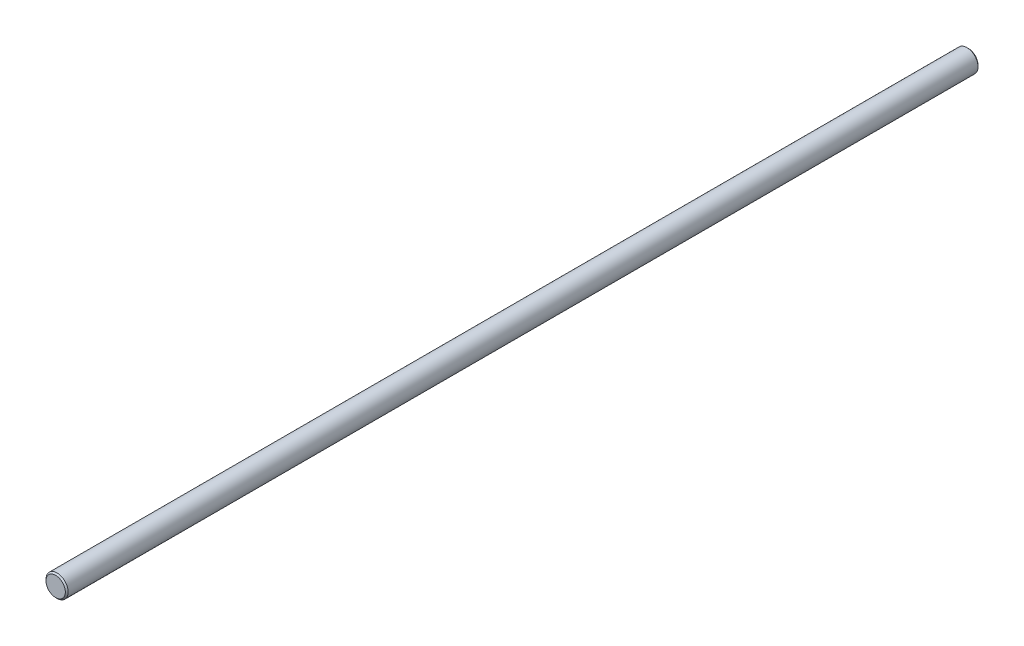
ISO-10303-21;
HEADER;
FILE_DESCRIPTION(('STEP AP214'),'2;1');
FILE_NAME('part.step','',(''),(''),'','','');
FILE_SCHEMA(('AUTOMOTIVE_DESIGN { 1 0 10303 214 1 1 1 1 }'));
ENDSEC;
DATA;
#1=APPLICATION_CONTEXT('core data for automotive mechanical design processes');
#2=APPLICATION_PROTOCOL_DEFINITION('international standard','automotive_design',2000,#1);
#3=PRODUCT_CONTEXT('',#1,'mechanical');
#4=PRODUCT('Part','Part','',(#3));
#5=PRODUCT_RELATED_PRODUCT_CATEGORY('part','',(#4));
#6=PRODUCT_DEFINITION_FORMATION('','',#4);
#7=PRODUCT_DEFINITION_CONTEXT('part definition',#1,'design');
#8=PRODUCT_DEFINITION('design','',#6,#7);
#9=PRODUCT_DEFINITION_SHAPE('','',#8);
#10=(LENGTH_UNIT() NAMED_UNIT(*) SI_UNIT(.MILLI.,.METRE.));
#11=(NAMED_UNIT(*) PLANE_ANGLE_UNIT() SI_UNIT($,.RADIAN.));
#12=(NAMED_UNIT(*) SI_UNIT($,.STERADIAN.) SOLID_ANGLE_UNIT());
#13=UNCERTAINTY_MEASURE_WITH_UNIT(LENGTH_MEASURE(1.E-05),#10,'distance_accuracy_value','');
#14=(GEOMETRIC_REPRESENTATION_CONTEXT(3) GLOBAL_UNCERTAINTY_ASSIGNED_CONTEXT((#13)) GLOBAL_UNIT_ASSIGNED_CONTEXT((#10,
#11,#12)) REPRESENTATION_CONTEXT('',''));
#15=CARTESIAN_POINT('',(0.,0.,0.));
#16=DIRECTION('',(0.,0.,1.));
#17=DIRECTION('',(1.,0.,0.));
#18=AXIS2_PLACEMENT_3D('',#15,#16,#17);
#19=CARTESIAN_POINT('',(0.,0.,329.5));
#20=DIRECTION('',(0.,0.,-1.));
#21=DIRECTION('',(-1.,0.,0.));
#22=AXIS2_PLACEMENT_3D('',#19,#20,#21);
#23=CONICAL_SURFACE('',#22,4.,0.785398163397448);
#24=CARTESIAN_POINT('',(0.,0.,330.));
#25=DIRECTION('',(0.,0.,-1.));
#26=DIRECTION('',(-1.,0.,0.));
#27=AXIS2_PLACEMENT_3D('',#24,#25,#26);
#28=CIRCLE('',#27,3.5);
#29=CARTESIAN_POINT('',(-3.5,0.,330.));
#30=VERTEX_POINT('',#29);
#31=EDGE_CURVE('E42',#30,#30,#28,.T.);
#32=ORIENTED_EDGE('',*,*,#31,.T.);
#33=EDGE_LOOP('',(#32));
#34=FACE_BOUND('',#33,.T.);
#35=CARTESIAN_POINT('',(0.,0.,329.5));
#36=DIRECTION('',(0.,0.,-1.));
#37=DIRECTION('',(-1.,0.,0.));
#38=AXIS2_PLACEMENT_3D('',#35,#36,#37);
#39=CIRCLE('',#38,4.);
#40=CARTESIAN_POINT('',(-4.,0.,329.5));
#41=VERTEX_POINT('',#40);
#42=EDGE_CURVE('E10',#41,#41,#39,.T.);
#43=ORIENTED_EDGE('',*,*,#42,.F.);
#44=EDGE_LOOP('',(#43));
#45=FACE_BOUND('',#44,.T.);
#46=ADVANCED_FACE('F28',(#34,#45),#23,.T.);
#47=CARTESIAN_POINT('',(0.,0.,330.));
#48=DIRECTION('',(0.,0.,-1.));
#49=DIRECTION('',(-1.,0.,0.));
#50=AXIS2_PLACEMENT_3D('',#47,#48,#49);
#51=CYLINDRICAL_SURFACE('',#50,4.);
#52=ORIENTED_EDGE('',*,*,#42,.T.);
#53=EDGE_LOOP('',(#52));
#54=FACE_BOUND('',#53,.T.);
#55=CARTESIAN_POINT('',(0.,0.,0.5));
#56=DIRECTION('',(0.,0.,-1.));
#57=DIRECTION('',(-1.,0.,0.));
#58=AXIS2_PLACEMENT_3D('',#55,#56,#57);
#59=CIRCLE('',#58,4.);
#60=CARTESIAN_POINT('',(-4.,0.,0.5));
#61=VERTEX_POINT('',#60);
#62=EDGE_CURVE('E34',#61,#61,#59,.T.);
#63=ORIENTED_EDGE('',*,*,#62,.F.);
#64=EDGE_LOOP('',(#63));
#65=FACE_BOUND('',#64,.T.);
#66=ADVANCED_FACE('F61',(#54,#65),#51,.T.);
#67=CARTESIAN_POINT('',(0.,0.,0.));
#68=DIRECTION('',(0.,0.,1.));
#69=DIRECTION('',(1.,0.,0.));
#70=AXIS2_PLACEMENT_3D('',#67,#68,#69);
#71=CONICAL_SURFACE('',#70,3.5,0.785398163397448);
#72=ORIENTED_EDGE('',*,*,#62,.T.);
#73=EDGE_LOOP('',(#72));
#74=FACE_BOUND('',#73,.T.);
#75=CARTESIAN_POINT('',(0.,0.,0.));
#76=DIRECTION('',(0.,0.,-1.));
#77=DIRECTION('',(-1.,0.,0.));
#78=AXIS2_PLACEMENT_3D('',#75,#76,#77);
#79=CIRCLE('',#78,3.5);
#80=CARTESIAN_POINT('',(-3.5,0.,0.));
#81=VERTEX_POINT('',#80);
#82=EDGE_CURVE('E38',#81,#81,#79,.T.);
#83=ORIENTED_EDGE('',*,*,#82,.F.);
#84=EDGE_LOOP('',(#83));
#85=FACE_BOUND('',#84,.T.);
#86=ADVANCED_FACE('F57',(#74,#85),#71,.T.);
#87=CARTESIAN_POINT('',(0.,0.,0.));
#88=DIRECTION('',(0.,0.,-1.));
#89=DIRECTION('',(-1.,0.,0.));
#90=AXIS2_PLACEMENT_3D('',#87,#88,#89);
#91=PLANE('',#90);
#92=ORIENTED_EDGE('',*,*,#82,.T.);
#93=EDGE_LOOP('',(#92));
#94=FACE_BOUND('',#93,.T.);
#95=ADVANCED_FACE('F52',(#94),#91,.T.);
#96=CARTESIAN_POINT('',(3.5,0.,330.));
#97=DIRECTION('',(0.,0.,1.));
#98=DIRECTION('',(1.,0.,0.));
#99=AXIS2_PLACEMENT_3D('',#96,#97,#98);
#100=PLANE('',#99);
#101=ORIENTED_EDGE('',*,*,#31,.F.);
#102=EDGE_LOOP('',(#101));
#103=FACE_BOUND('',#102,.T.);
#104=ADVANCED_FACE('F50',(#103),#100,.T.);
#105=CLOSED_SHELL('',(#46,#66,#86,#95,#104));
#106=MANIFOLD_SOLID_BREP('B2',#105);
#107=ADVANCED_BREP_SHAPE_REPRESENTATION('',(#18,#106),#14);
#108=SHAPE_DEFINITION_REPRESENTATION(#9,#107);
ENDSEC;
END-ISO-10303-21;
